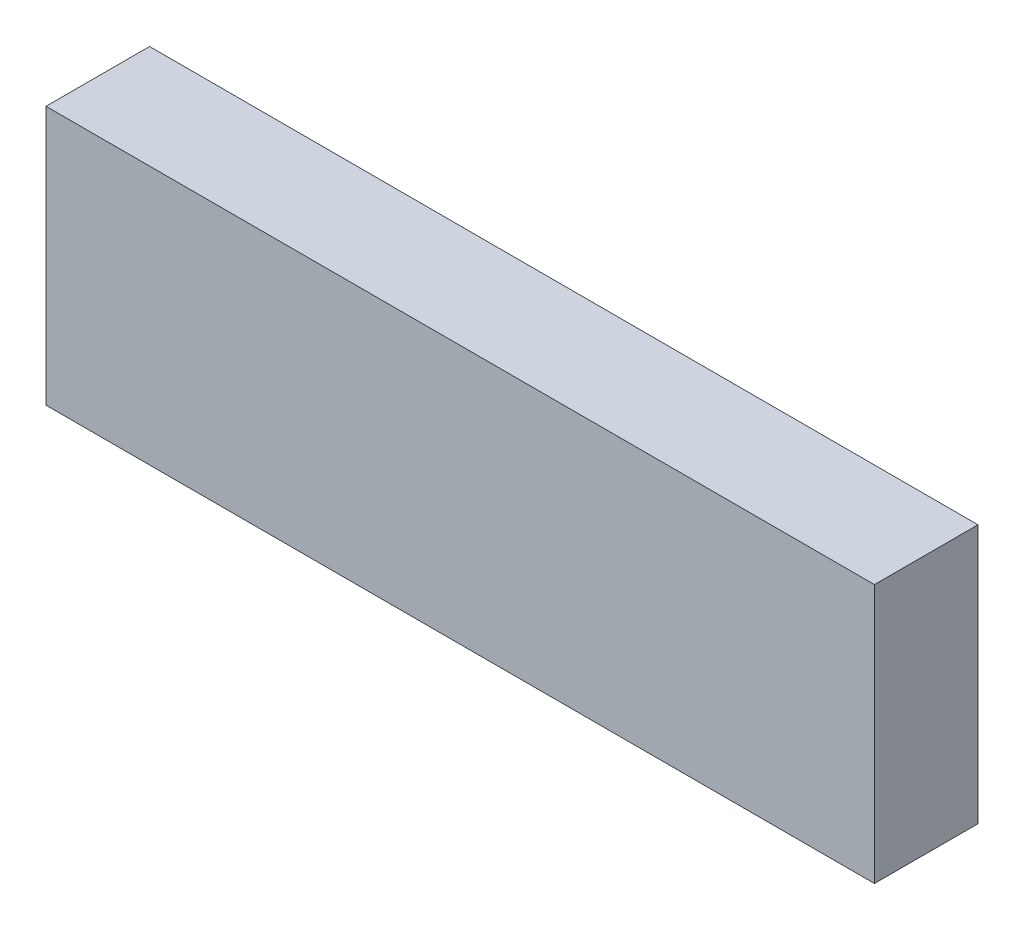
ISO-10303-21;
HEADER;
FILE_DESCRIPTION(('STEP AP214'),'2;1');
FILE_NAME('part.step','',(''),(''),'','','');
FILE_SCHEMA(('AUTOMOTIVE_DESIGN { 1 0 10303 214 1 1 1 1 }'));
ENDSEC;
DATA;
#1=APPLICATION_CONTEXT('core data for automotive mechanical design processes');
#2=APPLICATION_PROTOCOL_DEFINITION('international standard','automotive_design',2000,#1);
#3=PRODUCT_CONTEXT('',#1,'mechanical');
#4=PRODUCT('Part','Part','',(#3));
#5=PRODUCT_RELATED_PRODUCT_CATEGORY('part','',(#4));
#6=PRODUCT_DEFINITION_FORMATION('','',#4);
#7=PRODUCT_DEFINITION_CONTEXT('part definition',#1,'design');
#8=PRODUCT_DEFINITION('design','',#6,#7);
#9=PRODUCT_DEFINITION_SHAPE('','',#8);
#10=(LENGTH_UNIT() NAMED_UNIT(*) SI_UNIT(.MILLI.,.METRE.));
#11=(NAMED_UNIT(*) PLANE_ANGLE_UNIT() SI_UNIT($,.RADIAN.));
#12=(NAMED_UNIT(*) SI_UNIT($,.STERADIAN.) SOLID_ANGLE_UNIT());
#13=UNCERTAINTY_MEASURE_WITH_UNIT(LENGTH_MEASURE(1.E-05),#10,'distance_accuracy_value','');
#14=(GEOMETRIC_REPRESENTATION_CONTEXT(3) GLOBAL_UNCERTAINTY_ASSIGNED_CONTEXT((#13)) GLOBAL_UNIT_ASSIGNED_CONTEXT((#10,
#11,#12)) REPRESENTATION_CONTEXT('',''));
#15=CARTESIAN_POINT('',(0.,0.,0.));
#16=DIRECTION('',(0.,0.,1.));
#17=DIRECTION('',(1.,0.,0.));
#18=AXIS2_PLACEMENT_3D('',#15,#16,#17);
#19=CARTESIAN_POINT('',(40.,-12.5,10.));
#20=DIRECTION('',(-1.,0.,0.));
#21=DIRECTION('',(0.,0.,1.));
#22=AXIS2_PLACEMENT_3D('',#19,#20,#21);
#23=PLANE('',#22);
#24=DIRECTION('',(0.,1.,0.));
#25=VECTOR('',#24,1.);
#26=CARTESIAN_POINT('',(40.,-12.5,0.));
#27=LINE('',#26,#25);
#28=CARTESIAN_POINT('',(40.,-12.5,0.));
#29=VERTEX_POINT('',#28);
#30=CARTESIAN_POINT('',(40.,12.5,0.));
#31=VERTEX_POINT('',#30);
#32=EDGE_CURVE('E102',#29,#31,#27,.T.);
#33=ORIENTED_EDGE('',*,*,#32,.T.);
#34=DIRECTION('',(0.,0.,-1.));
#35=VECTOR('',#34,1.);
#36=CARTESIAN_POINT('',(40.,12.5,10.));
#37=LINE('',#36,#35);
#38=CARTESIAN_POINT('',(40.,12.5,10.));
#39=VERTEX_POINT('',#38);
#40=EDGE_CURVE('E11',#39,#31,#37,.T.);
#41=ORIENTED_EDGE('',*,*,#40,.F.);
#42=DIRECTION('',(0.,1.,0.));
#43=VECTOR('',#42,1.);
#44=CARTESIAN_POINT('',(40.,-12.5,10.));
#45=LINE('',#44,#43);
#46=CARTESIAN_POINT('',(40.,-12.5,10.));
#47=VERTEX_POINT('',#46);
#48=EDGE_CURVE('E90',#47,#39,#45,.T.);
#49=ORIENTED_EDGE('',*,*,#48,.F.);
#50=DIRECTION('',(0.,0.,-1.));
#51=VECTOR('',#50,1.);
#52=CARTESIAN_POINT('',(40.,-12.5,10.));
#53=LINE('',#52,#51);
#54=EDGE_CURVE('E98',#47,#29,#53,.T.);
#55=ORIENTED_EDGE('',*,*,#54,.T.);
#56=EDGE_LOOP('',(#33,#41,#49,#55));
#57=FACE_BOUND('',#56,.T.);
#58=ADVANCED_FACE('F39',(#57),#23,.F.);
#59=CARTESIAN_POINT('',(-40.,12.5,10.));
#60=DIRECTION('',(0.,-1.,0.));
#61=DIRECTION('',(0.,0.,-1.));
#62=AXIS2_PLACEMENT_3D('',#59,#60,#61);
#63=PLANE('',#62);
#64=DIRECTION('',(-1.,0.,0.));
#65=VECTOR('',#64,1.);
#66=CARTESIAN_POINT('',(-40.,12.5,0.));
#67=LINE('',#66,#65);
#68=CARTESIAN_POINT('',(-40.,12.5,0.));
#69=VERTEX_POINT('',#68);
#70=EDGE_CURVE('E94',#31,#69,#67,.T.);
#71=ORIENTED_EDGE('',*,*,#70,.T.);
#72=DIRECTION('',(0.,0.,-1.));
#73=VECTOR('',#72,1.);
#74=CARTESIAN_POINT('',(-40.,12.5,10.));
#75=LINE('',#74,#73);
#76=CARTESIAN_POINT('',(-40.,12.5,10.));
#77=VERTEX_POINT('',#76);
#78=EDGE_CURVE('E47',#77,#69,#75,.T.);
#79=ORIENTED_EDGE('',*,*,#78,.F.);
#80=DIRECTION('',(-1.,0.,0.));
#81=VECTOR('',#80,1.);
#82=CARTESIAN_POINT('',(-40.,12.5,10.));
#83=LINE('',#82,#81);
#84=EDGE_CURVE('E85',#39,#77,#83,.T.);
#85=ORIENTED_EDGE('',*,*,#84,.F.);
#86=ORIENTED_EDGE('',*,*,#40,.T.);
#87=EDGE_LOOP('',(#71,#79,#85,#86));
#88=FACE_BOUND('',#87,.T.);
#89=ADVANCED_FACE('F93',(#88),#63,.F.);
#90=CARTESIAN_POINT('',(-40.,-12.5,10.));
#91=DIRECTION('',(1.,0.,0.));
#92=DIRECTION('',(0.,0.,-1.));
#93=AXIS2_PLACEMENT_3D('',#90,#91,#92);
#94=PLANE('',#93);
#95=DIRECTION('',(0.,-1.,0.));
#96=VECTOR('',#95,1.);
#97=CARTESIAN_POINT('',(-40.,-12.5,0.));
#98=LINE('',#97,#96);
#99=CARTESIAN_POINT('',(-40.,-12.5,0.));
#100=VERTEX_POINT('',#99);
#101=EDGE_CURVE('E72',#69,#100,#98,.T.);
#102=ORIENTED_EDGE('',*,*,#101,.T.);
#103=DIRECTION('',(0.,0.,-1.));
#104=VECTOR('',#103,1.);
#105=CARTESIAN_POINT('',(-40.,-12.5,10.));
#106=LINE('',#105,#104);
#107=CARTESIAN_POINT('',(-40.,-12.5,10.));
#108=VERTEX_POINT('',#107);
#109=EDGE_CURVE('E95',#108,#100,#106,.T.);
#110=ORIENTED_EDGE('',*,*,#109,.F.);
#111=DIRECTION('',(0.,-1.,0.));
#112=VECTOR('',#111,1.);
#113=CARTESIAN_POINT('',(-40.,-12.5,10.));
#114=LINE('',#113,#112);
#115=EDGE_CURVE('E88',#77,#108,#114,.T.);
#116=ORIENTED_EDGE('',*,*,#115,.F.);
#117=ORIENTED_EDGE('',*,*,#78,.T.);
#118=EDGE_LOOP('',(#102,#110,#116,#117));
#119=FACE_BOUND('',#118,.T.);
#120=ADVANCED_FACE('F96',(#119),#94,.F.);
#121=CARTESIAN_POINT('',(-40.,-12.5,10.));
#122=DIRECTION('',(0.,1.,0.));
#123=DIRECTION('',(0.,0.,1.));
#124=AXIS2_PLACEMENT_3D('',#121,#122,#123);
#125=PLANE('',#124);
#126=DIRECTION('',(1.,0.,0.));
#127=VECTOR('',#126,1.);
#128=CARTESIAN_POINT('',(-40.,-12.5,0.));
#129=LINE('',#128,#127);
#130=EDGE_CURVE('E78',#100,#29,#129,.T.);
#131=ORIENTED_EDGE('',*,*,#130,.T.);
#132=ORIENTED_EDGE('',*,*,#54,.F.);
#133=DIRECTION('',(1.,0.,0.));
#134=VECTOR('',#133,1.);
#135=CARTESIAN_POINT('',(-40.,-12.5,10.));
#136=LINE('',#135,#134);
#137=EDGE_CURVE('E55',#108,#47,#136,.T.);
#138=ORIENTED_EDGE('',*,*,#137,.F.);
#139=ORIENTED_EDGE('',*,*,#109,.T.);
#140=EDGE_LOOP('',(#131,#132,#138,#139));
#141=FACE_BOUND('',#140,.T.);
#142=ADVANCED_FACE('F109',(#141),#125,.F.);
#143=CARTESIAN_POINT('',(0.,0.,10.));
#144=DIRECTION('',(0.,0.,-1.));
#145=DIRECTION('',(-1.,0.,0.));
#146=AXIS2_PLACEMENT_3D('',#143,#144,#145);
#147=PLANE('',#146);
#148=ORIENTED_EDGE('',*,*,#48,.T.);
#149=ORIENTED_EDGE('',*,*,#84,.T.);
#150=ORIENTED_EDGE('',*,*,#115,.T.);
#151=ORIENTED_EDGE('',*,*,#137,.T.);
#152=EDGE_LOOP('',(#148,#149,#150,#151));
#153=FACE_BOUND('',#152,.T.);
#154=ADVANCED_FACE('F86',(#153),#147,.F.);
#155=CARTESIAN_POINT('',(0.,0.,0.));
#156=DIRECTION('',(0.,0.,-1.));
#157=DIRECTION('',(-1.,0.,0.));
#158=AXIS2_PLACEMENT_3D('',#155,#156,#157);
#159=PLANE('',#158);
#160=ORIENTED_EDGE('',*,*,#32,.F.);
#161=ORIENTED_EDGE('',*,*,#130,.F.);
#162=ORIENTED_EDGE('',*,*,#101,.F.);
#163=ORIENTED_EDGE('',*,*,#70,.F.);
#164=EDGE_LOOP('',(#160,#161,#162,#163));
#165=FACE_BOUND('',#164,.T.);
#166=ADVANCED_FACE('F112',(#165),#159,.T.);
#167=CLOSED_SHELL('',(#58,#89,#120,#142,#154,#166));
#168=MANIFOLD_SOLID_BREP('B2',#167);
#169=ADVANCED_BREP_SHAPE_REPRESENTATION('',(#18,#168),#14);
#170=SHAPE_DEFINITION_REPRESENTATION(#9,#169);
ENDSEC;
END-ISO-10303-21;
